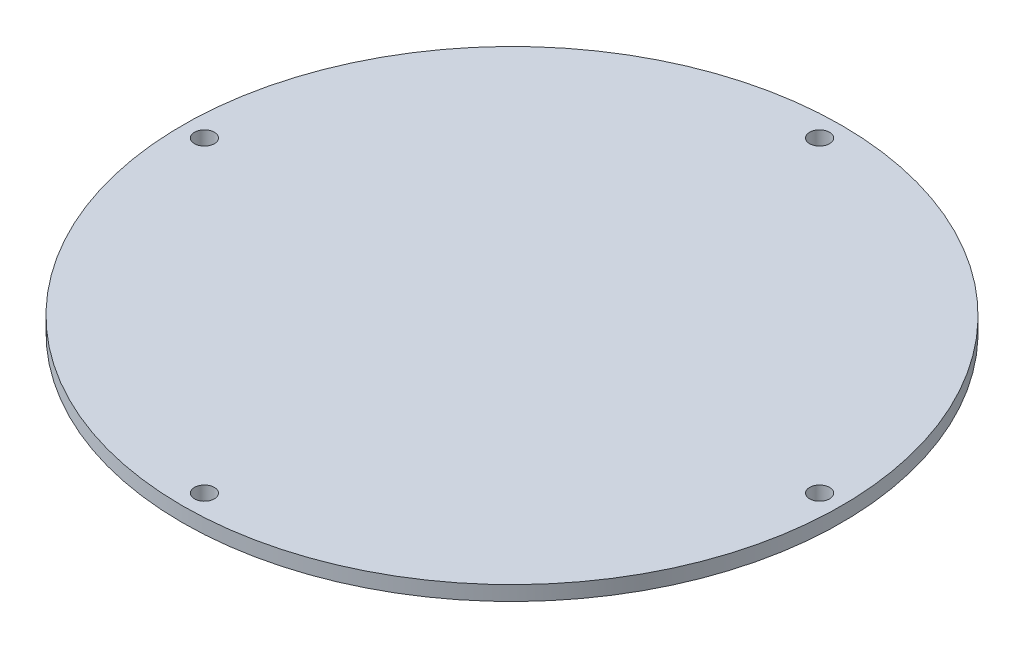
ISO-10303-21;
HEADER;
FILE_DESCRIPTION(('STEP AP214'),'2;1');
FILE_NAME('part.step','',(''),(''),'','','');
FILE_SCHEMA(('AUTOMOTIVE_DESIGN { 1 0 10303 214 1 1 1 1 }'));
ENDSEC;
DATA;
#1=APPLICATION_CONTEXT('core data for automotive mechanical design processes');
#2=APPLICATION_PROTOCOL_DEFINITION('international standard','automotive_design',2000,#1);
#3=PRODUCT_CONTEXT('',#1,'mechanical');
#4=PRODUCT('Part','Part','',(#3));
#5=PRODUCT_RELATED_PRODUCT_CATEGORY('part','',(#4));
#6=PRODUCT_DEFINITION_FORMATION('','',#4);
#7=PRODUCT_DEFINITION_CONTEXT('part definition',#1,'design');
#8=PRODUCT_DEFINITION('design','',#6,#7);
#9=PRODUCT_DEFINITION_SHAPE('','',#8);
#10=(LENGTH_UNIT() NAMED_UNIT(*) SI_UNIT(.MILLI.,.METRE.));
#11=(NAMED_UNIT(*) PLANE_ANGLE_UNIT() SI_UNIT($,.RADIAN.));
#12=(NAMED_UNIT(*) SI_UNIT($,.STERADIAN.) SOLID_ANGLE_UNIT());
#13=UNCERTAINTY_MEASURE_WITH_UNIT(LENGTH_MEASURE(1.E-05),#10,'distance_accuracy_value','');
#14=(GEOMETRIC_REPRESENTATION_CONTEXT(3) GLOBAL_UNCERTAINTY_ASSIGNED_CONTEXT((#13)) GLOBAL_UNIT_ASSIGNED_CONTEXT((#10,
#11,#12)) REPRESENTATION_CONTEXT('',''));
#15=CARTESIAN_POINT('',(0.,0.,0.));
#16=DIRECTION('',(0.,0.,1.));
#17=DIRECTION('',(1.,0.,0.));
#18=AXIS2_PLACEMENT_3D('',#15,#16,#17);
#19=CARTESIAN_POINT('',(0.,2.54,0.));
#20=DIRECTION('',(0.,-1.,0.));
#21=DIRECTION('',(0.,0.,-1.));
#22=AXIS2_PLACEMENT_3D('',#19,#20,#21);
#23=CYLINDRICAL_SURFACE('',#22,57.15);
#24=CARTESIAN_POINT('',(0.,2.54,0.));
#25=DIRECTION('',(0.,1.,0.));
#26=DIRECTION('',(0.,0.,1.));
#27=AXIS2_PLACEMENT_3D('',#24,#25,#26);
#28=CIRCLE('',#27,57.15);
#29=CARTESIAN_POINT('',(0.,2.54,57.15));
#30=VERTEX_POINT('',#29);
#31=EDGE_CURVE('E10',#30,#30,#28,.T.);
#32=ORIENTED_EDGE('',*,*,#31,.F.);
#33=EDGE_LOOP('',(#32));
#34=FACE_BOUND('',#33,.T.);
#35=CARTESIAN_POINT('',(0.,0.,0.));
#36=DIRECTION('',(0.,1.,0.));
#37=DIRECTION('',(0.,0.,1.));
#38=AXIS2_PLACEMENT_3D('',#35,#36,#37);
#39=CIRCLE('',#38,57.15);
#40=CARTESIAN_POINT('',(0.,0.,57.15));
#41=VERTEX_POINT('',#40);
#42=EDGE_CURVE('E51',#41,#41,#39,.T.);
#43=ORIENTED_EDGE('',*,*,#42,.T.);
#44=EDGE_LOOP('',(#43));
#45=FACE_BOUND('',#44,.T.);
#46=ADVANCED_FACE('F48',(#34,#45),#23,.T.);
#47=CARTESIAN_POINT('',(0.,2.54,0.));
#48=DIRECTION('',(0.,1.,0.));
#49=DIRECTION('',(0.,0.,1.));
#50=AXIS2_PLACEMENT_3D('',#47,#48,#49);
#51=PLANE('',#50);
#52=CARTESIAN_POINT('',(-5.58706843841678E-13,2.54,-53.34));
#53=DIRECTION('',(0.,1.,0.));
#54=DIRECTION('',(0.,0.,1.));
#55=AXIS2_PLACEMENT_3D('',#52,#53,#54);
#56=CIRCLE('',#55,1.72719999999999);
#57=CARTESIAN_POINT('',(-5.58706843841678E-13,2.54,-51.6128));
#58=VERTEX_POINT('',#57);
#59=EDGE_CURVE('E80',#58,#58,#56,.T.);
#60=ORIENTED_EDGE('',*,*,#59,.F.);
#61=EDGE_LOOP('',(#60));
#62=FACE_BOUND('',#61,.T.);
#63=CARTESIAN_POINT('',(53.34,2.54,0.));
#64=DIRECTION('',(0.,1.,0.));
#65=DIRECTION('',(0.,0.,1.));
#66=AXIS2_PLACEMENT_3D('',#63,#64,#65);
#67=CIRCLE('',#66,1.72719999999998);
#68=CARTESIAN_POINT('',(53.34,2.54,1.72719999999998));
#69=VERTEX_POINT('',#68);
#70=EDGE_CURVE('E74',#69,#69,#67,.T.);
#71=ORIENTED_EDGE('',*,*,#70,.F.);
#72=EDGE_LOOP('',(#71));
#73=FACE_BOUND('',#72,.T.);
#74=CARTESIAN_POINT('',(1.86235614613893E-13,2.54,53.34));
#75=DIRECTION('',(0.,1.,0.));
#76=DIRECTION('',(0.,0.,1.));
#77=AXIS2_PLACEMENT_3D('',#74,#75,#76);
#78=CIRCLE('',#77,1.72719999999999);
#79=CARTESIAN_POINT('',(1.86235614613893E-13,2.54,55.0672));
#80=VERTEX_POINT('',#79);
#81=EDGE_CURVE('E68',#80,#80,#78,.T.);
#82=ORIENTED_EDGE('',*,*,#81,.F.);
#83=EDGE_LOOP('',(#82));
#84=FACE_BOUND('',#83,.T.);
#85=CARTESIAN_POINT('',(-53.34,2.54,0.));
#86=DIRECTION('',(0.,1.,0.));
#87=DIRECTION('',(0.,0.,1.));
#88=AXIS2_PLACEMENT_3D('',#85,#86,#87);
#89=CIRCLE('',#88,1.72719999999998);
#90=CARTESIAN_POINT('',(-53.34,2.54,1.72719999999998));
#91=VERTEX_POINT('',#90);
#92=EDGE_CURVE('E62',#91,#91,#89,.T.);
#93=ORIENTED_EDGE('',*,*,#92,.F.);
#94=EDGE_LOOP('',(#93));
#95=FACE_BOUND('',#94,.T.);
#96=ORIENTED_EDGE('',*,*,#31,.T.);
#97=EDGE_LOOP('',(#96));
#98=FACE_BOUND('',#97,.T.);
#99=ADVANCED_FACE('F86',(#62,#73,#84,#95,#98),#51,.T.);
#100=CARTESIAN_POINT('',(0.,0.,0.));
#101=DIRECTION('',(0.,1.,0.));
#102=DIRECTION('',(0.,0.,1.));
#103=AXIS2_PLACEMENT_3D('',#100,#101,#102);
#104=PLANE('',#103);
#105=CARTESIAN_POINT('',(-5.58706843841678E-13,0.,-53.34));
#106=DIRECTION('',(0.,1.,0.));
#107=DIRECTION('',(0.,0.,1.));
#108=AXIS2_PLACEMENT_3D('',#105,#106,#107);
#109=CIRCLE('',#108,1.7272);
#110=CARTESIAN_POINT('',(-5.58706843841678E-13,0.,-51.6128));
#111=VERTEX_POINT('',#110);
#112=EDGE_CURVE('E77',#111,#111,#109,.T.);
#113=ORIENTED_EDGE('',*,*,#112,.T.);
#114=EDGE_LOOP('',(#113));
#115=FACE_BOUND('',#114,.T.);
#116=CARTESIAN_POINT('',(53.34,0.,0.));
#117=DIRECTION('',(0.,1.,0.));
#118=DIRECTION('',(0.,0.,1.));
#119=AXIS2_PLACEMENT_3D('',#116,#117,#118);
#120=CIRCLE('',#119,1.7272);
#121=CARTESIAN_POINT('',(53.34,0.,1.7272));
#122=VERTEX_POINT('',#121);
#123=EDGE_CURVE('E71',#122,#122,#120,.T.);
#124=ORIENTED_EDGE('',*,*,#123,.T.);
#125=EDGE_LOOP('',(#124));
#126=FACE_BOUND('',#125,.T.);
#127=CARTESIAN_POINT('',(1.86235614613893E-13,0.,53.34));
#128=DIRECTION('',(0.,1.,0.));
#129=DIRECTION('',(0.,0.,1.));
#130=AXIS2_PLACEMENT_3D('',#127,#128,#129);
#131=CIRCLE('',#130,1.7272);
#132=CARTESIAN_POINT('',(1.86235614613893E-13,0.,55.0672));
#133=VERTEX_POINT('',#132);
#134=EDGE_CURVE('E65',#133,#133,#131,.T.);
#135=ORIENTED_EDGE('',*,*,#134,.T.);
#136=EDGE_LOOP('',(#135));
#137=FACE_BOUND('',#136,.T.);
#138=CARTESIAN_POINT('',(-53.34,0.,0.));
#139=DIRECTION('',(0.,1.,0.));
#140=DIRECTION('',(0.,0.,1.));
#141=AXIS2_PLACEMENT_3D('',#138,#139,#140);
#142=CIRCLE('',#141,1.7272);
#143=CARTESIAN_POINT('',(-53.34,0.,1.7272));
#144=VERTEX_POINT('',#143);
#145=EDGE_CURVE('E58',#144,#144,#142,.T.);
#146=ORIENTED_EDGE('',*,*,#145,.T.);
#147=EDGE_LOOP('',(#146));
#148=FACE_BOUND('',#147,.T.);
#149=ORIENTED_EDGE('',*,*,#42,.F.);
#150=EDGE_LOOP('',(#149));
#151=FACE_BOUND('',#150,.T.);
#152=ADVANCED_FACE('F89',(#115,#126,#137,#148,#151),#104,.F.);
#153=CARTESIAN_POINT('',(-53.34,2.54,0.));
#154=DIRECTION('',(0.,1.,0.));
#155=DIRECTION('',(0.,0.,1.));
#156=AXIS2_PLACEMENT_3D('',#153,#154,#155);
#157=CYLINDRICAL_SURFACE('',#156,1.72719999999999);
#158=ORIENTED_EDGE('',*,*,#145,.F.);
#159=EDGE_LOOP('',(#158));
#160=FACE_BOUND('',#159,.T.);
#161=ORIENTED_EDGE('',*,*,#92,.T.);
#162=EDGE_LOOP('',(#161));
#163=FACE_BOUND('',#162,.T.);
#164=ADVANCED_FACE('F97',(#160,#163),#157,.F.);
#165=CARTESIAN_POINT('',(1.86235614613893E-13,2.54,53.34));
#166=DIRECTION('',(0.,1.,0.));
#167=DIRECTION('',(0.,0.,1.));
#168=AXIS2_PLACEMENT_3D('',#165,#166,#167);
#169=CYLINDRICAL_SURFACE('',#168,1.72719999999999);
#170=ORIENTED_EDGE('',*,*,#134,.F.);
#171=EDGE_LOOP('',(#170));
#172=FACE_BOUND('',#171,.T.);
#173=ORIENTED_EDGE('',*,*,#81,.T.);
#174=EDGE_LOOP('',(#173));
#175=FACE_BOUND('',#174,.T.);
#176=ADVANCED_FACE('F99',(#172,#175),#169,.F.);
#177=CARTESIAN_POINT('',(53.34,2.54,0.));
#178=DIRECTION('',(0.,1.,0.));
#179=DIRECTION('',(0.,0.,1.));
#180=AXIS2_PLACEMENT_3D('',#177,#178,#179);
#181=CYLINDRICAL_SURFACE('',#180,1.72719999999999);
#182=ORIENTED_EDGE('',*,*,#123,.F.);
#183=EDGE_LOOP('',(#182));
#184=FACE_BOUND('',#183,.T.);
#185=ORIENTED_EDGE('',*,*,#70,.T.);
#186=EDGE_LOOP('',(#185));
#187=FACE_BOUND('',#186,.T.);
#188=ADVANCED_FACE('F106',(#184,#187),#181,.F.);
#189=CARTESIAN_POINT('',(-5.58706843841678E-13,2.54,-53.34));
#190=DIRECTION('',(0.,1.,0.));
#191=DIRECTION('',(0.,0.,1.));
#192=AXIS2_PLACEMENT_3D('',#189,#190,#191);
#193=CYLINDRICAL_SURFACE('',#192,1.72719999999999);
#194=ORIENTED_EDGE('',*,*,#112,.F.);
#195=EDGE_LOOP('',(#194));
#196=FACE_BOUND('',#195,.T.);
#197=ORIENTED_EDGE('',*,*,#59,.T.);
#198=EDGE_LOOP('',(#197));
#199=FACE_BOUND('',#198,.T.);
#200=ADVANCED_FACE('F84',(#196,#199),#193,.F.);
#201=CLOSED_SHELL('',(#46,#99,#152,#164,#176,#188,#200));
#202=MANIFOLD_SOLID_BREP('B2',#201);
#203=ADVANCED_BREP_SHAPE_REPRESENTATION('',(#18,#202),#14);
#204=SHAPE_DEFINITION_REPRESENTATION(#9,#203);
ENDSEC;
END-ISO-10303-21;
